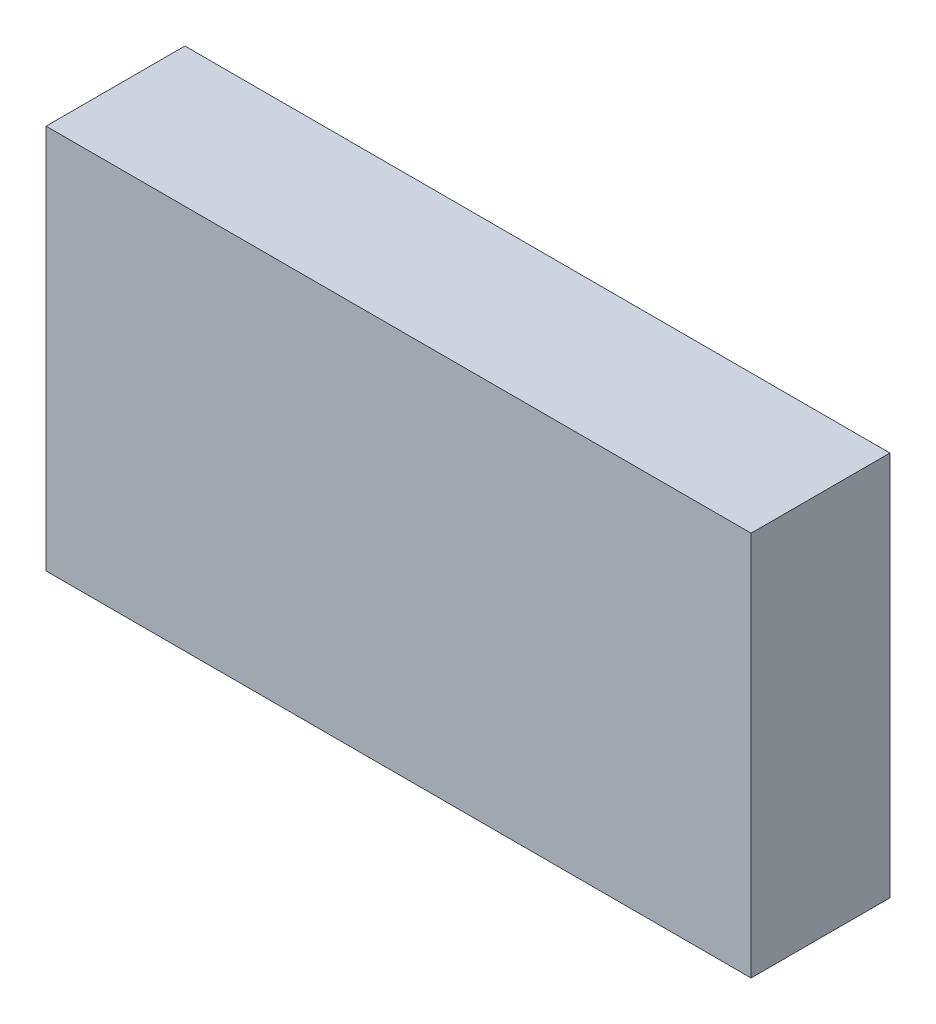
ISO-10303-21;
HEADER;
FILE_DESCRIPTION(('STEP AP214'),'2;1');
FILE_NAME('part.step','',(''),(''),'','','');
FILE_SCHEMA(('AUTOMOTIVE_DESIGN { 1 0 10303 214 1 1 1 1 }'));
ENDSEC;
DATA;
#1=APPLICATION_CONTEXT('core data for automotive mechanical design processes');
#2=APPLICATION_PROTOCOL_DEFINITION('international standard','automotive_design',2000,#1);
#3=PRODUCT_CONTEXT('',#1,'mechanical');
#4=PRODUCT('Part','Part','',(#3));
#5=PRODUCT_RELATED_PRODUCT_CATEGORY('part','',(#4));
#6=PRODUCT_DEFINITION_FORMATION('','',#4);
#7=PRODUCT_DEFINITION_CONTEXT('part definition',#1,'design');
#8=PRODUCT_DEFINITION('design','',#6,#7);
#9=PRODUCT_DEFINITION_SHAPE('','',#8);
#10=(LENGTH_UNIT() NAMED_UNIT(*) SI_UNIT(.MILLI.,.METRE.));
#11=(NAMED_UNIT(*) PLANE_ANGLE_UNIT() SI_UNIT($,.RADIAN.));
#12=(NAMED_UNIT(*) SI_UNIT($,.STERADIAN.) SOLID_ANGLE_UNIT());
#13=UNCERTAINTY_MEASURE_WITH_UNIT(LENGTH_MEASURE(1.E-05),#10,'distance_accuracy_value','');
#14=(GEOMETRIC_REPRESENTATION_CONTEXT(3) GLOBAL_UNCERTAINTY_ASSIGNED_CONTEXT((#13)) GLOBAL_UNIT_ASSIGNED_CONTEXT((#10,
#11,#12)) REPRESENTATION_CONTEXT('',''));
#15=CARTESIAN_POINT('',(0.,0.,0.));
#16=DIRECTION('',(0.,0.,1.));
#17=DIRECTION('',(1.,0.,0.));
#18=AXIS2_PLACEMENT_3D('',#15,#16,#17);
#19=CARTESIAN_POINT('',(-1.3699998,5.678805,2.54));
#20=DIRECTION('',(1.,0.,0.));
#21=DIRECTION('',(0.,0.,-1.));
#22=AXIS2_PLACEMENT_3D('',#19,#20,#21);
#23=PLANE('',#22);
#24=DIRECTION('',(0.,-1.,0.));
#25=VECTOR('',#24,1.);
#26=CARTESIAN_POINT('',(-1.3699998,5.678805,0.));
#27=LINE('',#26,#25);
#28=CARTESIAN_POINT('',(-1.3699998,5.678805,0.));
#29=VERTEX_POINT('',#28);
#30=CARTESIAN_POINT('',(-1.3699998,-1.3699998,0.));
#31=VERTEX_POINT('',#30);
#32=EDGE_CURVE('E95',#29,#31,#27,.T.);
#33=ORIENTED_EDGE('',*,*,#32,.T.);
#34=DIRECTION('',(0.,0.,-1.));
#35=VECTOR('',#34,1.);
#36=CARTESIAN_POINT('',(-1.3699998,-1.3699998,2.54));
#37=LINE('',#36,#35);
#38=CARTESIAN_POINT('',(-1.3699998,-1.3699998,2.54));
#39=VERTEX_POINT('',#38);
#40=EDGE_CURVE('E11',#39,#31,#37,.T.);
#41=ORIENTED_EDGE('',*,*,#40,.F.);
#42=DIRECTION('',(0.,-1.,0.));
#43=VECTOR('',#42,1.);
#44=CARTESIAN_POINT('',(-1.3699998,5.678805,2.54));
#45=LINE('',#44,#43);
#46=CARTESIAN_POINT('',(-1.3699998,5.678805,2.54));
#47=VERTEX_POINT('',#46);
#48=EDGE_CURVE('E83',#47,#39,#45,.T.);
#49=ORIENTED_EDGE('',*,*,#48,.F.);
#50=DIRECTION('',(0.,0.,-1.));
#51=VECTOR('',#50,1.);
#52=CARTESIAN_POINT('',(-1.3699998,5.678805,2.54));
#53=LINE('',#52,#51);
#54=EDGE_CURVE('E91',#47,#29,#53,.T.);
#55=ORIENTED_EDGE('',*,*,#54,.T.);
#56=EDGE_LOOP('',(#33,#41,#49,#55));
#57=FACE_BOUND('',#56,.T.);
#58=ADVANCED_FACE('F32',(#57),#23,.F.);
#59=CARTESIAN_POINT('',(-1.3699998,-1.3699998,2.54));
#60=DIRECTION('',(0.,1.,0.));
#61=DIRECTION('',(0.,0.,1.));
#62=AXIS2_PLACEMENT_3D('',#59,#60,#61);
#63=PLANE('',#62);
#64=DIRECTION('',(1.,0.,0.));
#65=VECTOR('',#64,1.);
#66=CARTESIAN_POINT('',(-1.3699998,-1.3699998,0.));
#67=LINE('',#66,#65);
#68=CARTESIAN_POINT('',(11.5299998,-1.3699998,0.));
#69=VERTEX_POINT('',#68);
#70=EDGE_CURVE('E87',#31,#69,#67,.T.);
#71=ORIENTED_EDGE('',*,*,#70,.T.);
#72=DIRECTION('',(0.,0.,-1.));
#73=VECTOR('',#72,1.);
#74=CARTESIAN_POINT('',(11.5299998,-1.3699998,2.54));
#75=LINE('',#74,#73);
#76=CARTESIAN_POINT('',(11.5299998,-1.3699998,2.54));
#77=VERTEX_POINT('',#76);
#78=EDGE_CURVE('E40',#77,#69,#75,.T.);
#79=ORIENTED_EDGE('',*,*,#78,.F.);
#80=DIRECTION('',(1.,0.,0.));
#81=VECTOR('',#80,1.);
#82=CARTESIAN_POINT('',(-1.3699998,-1.3699998,2.54));
#83=LINE('',#82,#81);
#84=EDGE_CURVE('E78',#39,#77,#83,.T.);
#85=ORIENTED_EDGE('',*,*,#84,.F.);
#86=ORIENTED_EDGE('',*,*,#40,.T.);
#87=EDGE_LOOP('',(#71,#79,#85,#86));
#88=FACE_BOUND('',#87,.T.);
#89=ADVANCED_FACE('F86',(#88),#63,.F.);
#90=CARTESIAN_POINT('',(11.5299998,-1.3699998,2.54));
#91=DIRECTION('',(-1.,0.,0.));
#92=DIRECTION('',(0.,0.,1.));
#93=AXIS2_PLACEMENT_3D('',#90,#91,#92);
#94=PLANE('',#93);
#95=DIRECTION('',(0.,1.,0.));
#96=VECTOR('',#95,1.);
#97=CARTESIAN_POINT('',(11.5299998,-1.3699998,0.));
#98=LINE('',#97,#96);
#99=CARTESIAN_POINT('',(11.5299998,5.678805,0.));
#100=VERTEX_POINT('',#99);
#101=EDGE_CURVE('E65',#69,#100,#98,.T.);
#102=ORIENTED_EDGE('',*,*,#101,.T.);
#103=DIRECTION('',(0.,0.,-1.));
#104=VECTOR('',#103,1.);
#105=CARTESIAN_POINT('',(11.5299998,5.678805,2.54));
#106=LINE('',#105,#104);
#107=CARTESIAN_POINT('',(11.5299998,5.678805,2.54));
#108=VERTEX_POINT('',#107);
#109=EDGE_CURVE('E88',#108,#100,#106,.T.);
#110=ORIENTED_EDGE('',*,*,#109,.F.);
#111=DIRECTION('',(0.,1.,0.));
#112=VECTOR('',#111,1.);
#113=CARTESIAN_POINT('',(11.5299998,-1.3699998,2.54));
#114=LINE('',#113,#112);
#115=EDGE_CURVE('E81',#77,#108,#114,.T.);
#116=ORIENTED_EDGE('',*,*,#115,.F.);
#117=ORIENTED_EDGE('',*,*,#78,.T.);
#118=EDGE_LOOP('',(#102,#110,#116,#117));
#119=FACE_BOUND('',#118,.T.);
#120=ADVANCED_FACE('F89',(#119),#94,.F.);
#121=CARTESIAN_POINT('',(11.5299998,5.678805,2.54));
#122=DIRECTION('',(0.,-1.,0.));
#123=DIRECTION('',(0.,0.,-1.));
#124=AXIS2_PLACEMENT_3D('',#121,#122,#123);
#125=PLANE('',#124);
#126=DIRECTION('',(-1.,0.,0.));
#127=VECTOR('',#126,1.);
#128=CARTESIAN_POINT('',(11.5299998,5.678805,0.));
#129=LINE('',#128,#127);
#130=EDGE_CURVE('E71',#100,#29,#129,.T.);
#131=ORIENTED_EDGE('',*,*,#130,.T.);
#132=ORIENTED_EDGE('',*,*,#54,.F.);
#133=DIRECTION('',(-1.,0.,0.));
#134=VECTOR('',#133,1.);
#135=CARTESIAN_POINT('',(11.5299998,5.678805,2.54));
#136=LINE('',#135,#134);
#137=EDGE_CURVE('E48',#108,#47,#136,.T.);
#138=ORIENTED_EDGE('',*,*,#137,.F.);
#139=ORIENTED_EDGE('',*,*,#109,.T.);
#140=EDGE_LOOP('',(#131,#132,#138,#139));
#141=FACE_BOUND('',#140,.T.);
#142=ADVANCED_FACE('F102',(#141),#125,.F.);
#143=CARTESIAN_POINT('',(0.,0.,2.54));
#144=DIRECTION('',(0.,0.,1.));
#145=DIRECTION('',(1.,0.,0.));
#146=AXIS2_PLACEMENT_3D('',#143,#144,#145);
#147=PLANE('',#146);
#148=ORIENTED_EDGE('',*,*,#48,.T.);
#149=ORIENTED_EDGE('',*,*,#84,.T.);
#150=ORIENTED_EDGE('',*,*,#115,.T.);
#151=ORIENTED_EDGE('',*,*,#137,.T.);
#152=EDGE_LOOP('',(#148,#149,#150,#151));
#153=FACE_BOUND('',#152,.T.);
#154=ADVANCED_FACE('F79',(#153),#147,.T.);
#155=CARTESIAN_POINT('',(0.,0.,0.));
#156=DIRECTION('',(0.,0.,1.));
#157=DIRECTION('',(1.,0.,0.));
#158=AXIS2_PLACEMENT_3D('',#155,#156,#157);
#159=PLANE('',#158);
#160=ORIENTED_EDGE('',*,*,#32,.F.);
#161=ORIENTED_EDGE('',*,*,#130,.F.);
#162=ORIENTED_EDGE('',*,*,#101,.F.);
#163=ORIENTED_EDGE('',*,*,#70,.F.);
#164=EDGE_LOOP('',(#160,#161,#162,#163));
#165=FACE_BOUND('',#164,.T.);
#166=ADVANCED_FACE('F105',(#165),#159,.F.);
#167=CLOSED_SHELL('',(#58,#89,#120,#142,#154,#166));
#168=MANIFOLD_SOLID_BREP('B2',#167);
#169=ADVANCED_BREP_SHAPE_REPRESENTATION('',(#18,#168),#14);
#170=SHAPE_DEFINITION_REPRESENTATION(#9,#169);
ENDSEC;
END-ISO-10303-21;
